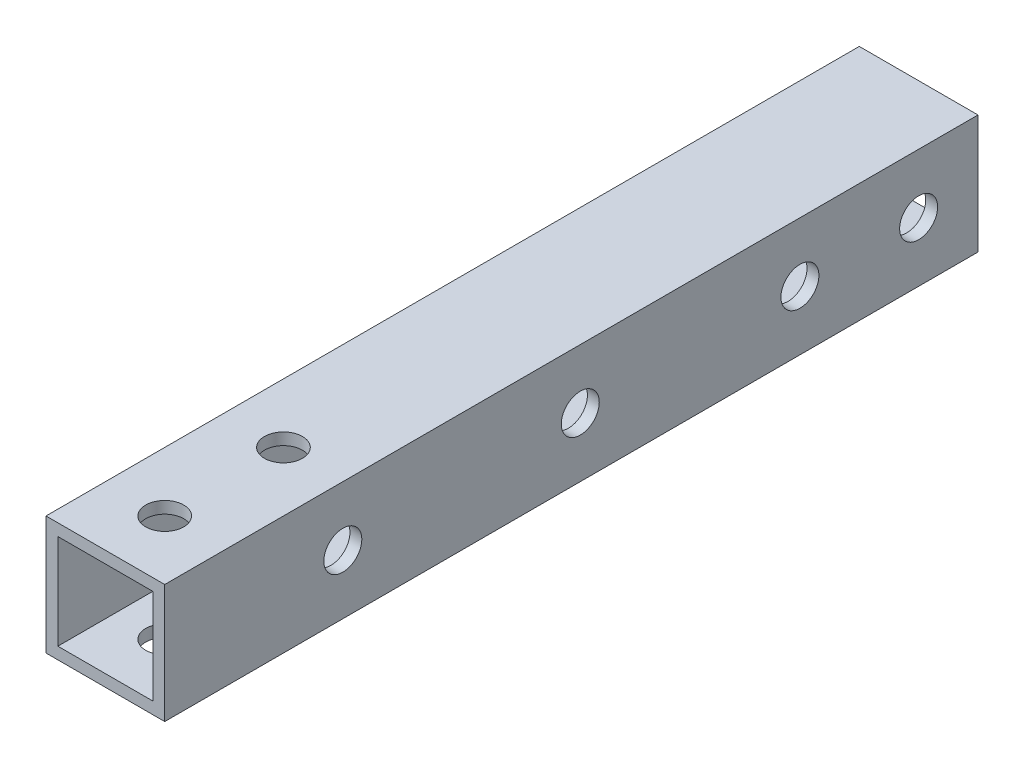
ISO-10303-21;
HEADER;
FILE_DESCRIPTION(('STEP AP214'),'2;1');
FILE_NAME('part.step','',(''),(''),'','','');
FILE_SCHEMA(('AUTOMOTIVE_DESIGN { 1 0 10303 214 1 1 1 1 }'));
ENDSEC;
DATA;
#1=APPLICATION_CONTEXT('core data for automotive mechanical design processes');
#2=APPLICATION_PROTOCOL_DEFINITION('international standard','automotive_design',2000,#1);
#3=PRODUCT_CONTEXT('',#1,'mechanical');
#4=PRODUCT('Part','Part','',(#3));
#5=PRODUCT_RELATED_PRODUCT_CATEGORY('part','',(#4));
#6=PRODUCT_DEFINITION_FORMATION('','',#4);
#7=PRODUCT_DEFINITION_CONTEXT('part definition',#1,'design');
#8=PRODUCT_DEFINITION('design','',#6,#7);
#9=PRODUCT_DEFINITION_SHAPE('','',#8);
#10=(LENGTH_UNIT() NAMED_UNIT(*) SI_UNIT(.MILLI.,.METRE.));
#11=(NAMED_UNIT(*) PLANE_ANGLE_UNIT() SI_UNIT($,.RADIAN.));
#12=(NAMED_UNIT(*) SI_UNIT($,.STERADIAN.) SOLID_ANGLE_UNIT());
#13=UNCERTAINTY_MEASURE_WITH_UNIT(LENGTH_MEASURE(1.E-05),#10,'distance_accuracy_value','');
#14=(GEOMETRIC_REPRESENTATION_CONTEXT(3) GLOBAL_UNCERTAINTY_ASSIGNED_CONTEXT((#13)) GLOBAL_UNIT_ASSIGNED_CONTEXT((#10,
#11,#12)) REPRESENTATION_CONTEXT('',''));
#15=CARTESIAN_POINT('',(0.,0.,0.));
#16=DIRECTION('',(0.,0.,1.));
#17=DIRECTION('',(1.,0.,0.));
#18=AXIS2_PLACEMENT_3D('',#15,#16,#17);
#19=CARTESIAN_POINT('',(0.,0.,68.5));
#20=DIRECTION('',(0.,0.,1.));
#21=DIRECTION('',(1.,0.,0.));
#22=AXIS2_PLACEMENT_3D('',#19,#20,#21);
#23=PLANE('',#22);
#24=DIRECTION('',(0.,-1.,0.));
#25=VECTOR('',#24,1.);
#26=CARTESIAN_POINT('',(-5.,5.,68.5));
#27=LINE('',#26,#25);
#28=CARTESIAN_POINT('',(-5.,5.,68.5));
#29=VERTEX_POINT('',#28);
#30=CARTESIAN_POINT('',(-5.,-5.,68.5));
#31=VERTEX_POINT('',#30);
#32=EDGE_CURVE('E164',#29,#31,#27,.T.);
#33=ORIENTED_EDGE('',*,*,#32,.T.);
#34=DIRECTION('',(1.,0.,0.));
#35=VECTOR('',#34,1.);
#36=CARTESIAN_POINT('',(5.,-5.,68.5));
#37=LINE('',#36,#35);
#38=CARTESIAN_POINT('',(5.,-5.,68.5));
#39=VERTEX_POINT('',#38);
#40=EDGE_CURVE('E167',#31,#39,#37,.T.);
#41=ORIENTED_EDGE('',*,*,#40,.T.);
#42=DIRECTION('',(0.,1.,0.));
#43=VECTOR('',#42,1.);
#44=CARTESIAN_POINT('',(5.,5.,68.5));
#45=LINE('',#44,#43);
#46=CARTESIAN_POINT('',(5.,5.,68.5));
#47=VERTEX_POINT('',#46);
#48=EDGE_CURVE('E170',#39,#47,#45,.T.);
#49=ORIENTED_EDGE('',*,*,#48,.T.);
#50=DIRECTION('',(-1.,0.,0.));
#51=VECTOR('',#50,1.);
#52=CARTESIAN_POINT('',(5.,5.,68.5));
#53=LINE('',#52,#51);
#54=EDGE_CURVE('E172',#47,#29,#53,.T.);
#55=ORIENTED_EDGE('',*,*,#54,.T.);
#56=EDGE_LOOP('',(#33,#41,#49,#55));
#57=FACE_BOUND('',#56,.T.);
#58=DIRECTION('',(1.,0.,0.));
#59=VECTOR('',#58,1.);
#60=CARTESIAN_POINT('',(0.,-4.,68.5));
#61=LINE('',#60,#59);
#62=CARTESIAN_POINT('',(-4.,-4.,68.5));
#63=VERTEX_POINT('',#62);
#64=CARTESIAN_POINT('',(4.,-4.,68.5));
#65=VERTEX_POINT('',#64);
#66=EDGE_CURVE('E134',#63,#65,#61,.T.);
#67=ORIENTED_EDGE('',*,*,#66,.F.);
#68=DIRECTION('',(0.,-1.,0.));
#69=VECTOR('',#68,1.);
#70=CARTESIAN_POINT('',(-4.,0.,68.5));
#71=LINE('',#70,#69);
#72=CARTESIAN_POINT('',(-4.,4.,68.5));
#73=VERTEX_POINT('',#72);
#74=EDGE_CURVE('E126',#73,#63,#71,.T.);
#75=ORIENTED_EDGE('',*,*,#74,.F.);
#76=DIRECTION('',(-1.,0.,0.));
#77=VECTOR('',#76,1.);
#78=CARTESIAN_POINT('',(0.,4.,68.5));
#79=LINE('',#78,#77);
#80=CARTESIAN_POINT('',(4.,4.,68.5));
#81=VERTEX_POINT('',#80);
#82=EDGE_CURVE('E148',#81,#73,#79,.T.);
#83=ORIENTED_EDGE('',*,*,#82,.F.);
#84=DIRECTION('',(0.,1.,0.));
#85=VECTOR('',#84,1.);
#86=CARTESIAN_POINT('',(4.,0.,68.5));
#87=LINE('',#86,#85);
#88=EDGE_CURVE('E146',#65,#81,#87,.T.);
#89=ORIENTED_EDGE('',*,*,#88,.F.);
#90=EDGE_LOOP('',(#67,#75,#83,#89));
#91=FACE_BOUND('',#90,.T.);
#92=ADVANCED_FACE('F59',(#57,#91),#23,.T.);
#93=CARTESIAN_POINT('',(0.,0.,0.));
#94=DIRECTION('',(0.,0.,1.));
#95=DIRECTION('',(1.,0.,0.));
#96=AXIS2_PLACEMENT_3D('',#93,#94,#95);
#97=PLANE('',#96);
#98=DIRECTION('',(0.,-1.,0.));
#99=VECTOR('',#98,1.);
#100=CARTESIAN_POINT('',(-5.,5.,0.));
#101=LINE('',#100,#99);
#102=CARTESIAN_POINT('',(-5.,5.,0.));
#103=VERTEX_POINT('',#102);
#104=CARTESIAN_POINT('',(-5.,-5.,0.));
#105=VERTEX_POINT('',#104);
#106=EDGE_CURVE('E142',#103,#105,#101,.T.);
#107=ORIENTED_EDGE('',*,*,#106,.F.);
#108=DIRECTION('',(-1.,0.,0.));
#109=VECTOR('',#108,1.);
#110=CARTESIAN_POINT('',(5.,5.,0.));
#111=LINE('',#110,#109);
#112=CARTESIAN_POINT('',(5.,5.,0.));
#113=VERTEX_POINT('',#112);
#114=EDGE_CURVE('E168',#113,#103,#111,.T.);
#115=ORIENTED_EDGE('',*,*,#114,.F.);
#116=DIRECTION('',(0.,1.,0.));
#117=VECTOR('',#116,1.);
#118=CARTESIAN_POINT('',(5.,5.,0.));
#119=LINE('',#118,#117);
#120=CARTESIAN_POINT('',(5.,-5.,0.));
#121=VERTEX_POINT('',#120);
#122=EDGE_CURVE('E179',#121,#113,#119,.T.);
#123=ORIENTED_EDGE('',*,*,#122,.F.);
#124=DIRECTION('',(1.,0.,0.));
#125=VECTOR('',#124,1.);
#126=CARTESIAN_POINT('',(5.,-5.,0.));
#127=LINE('',#126,#125);
#128=EDGE_CURVE('E177',#105,#121,#127,.T.);
#129=ORIENTED_EDGE('',*,*,#128,.F.);
#130=EDGE_LOOP('',(#107,#115,#123,#129));
#131=FACE_BOUND('',#130,.T.);
#132=DIRECTION('',(0.,-1.,0.));
#133=VECTOR('',#132,1.);
#134=CARTESIAN_POINT('',(-4.,0.,0.));
#135=LINE('',#134,#133);
#136=CARTESIAN_POINT('',(-4.,4.,0.));
#137=VERTEX_POINT('',#136);
#138=CARTESIAN_POINT('',(-4.,-4.,0.));
#139=VERTEX_POINT('',#138);
#140=EDGE_CURVE('E84',#137,#139,#135,.T.);
#141=ORIENTED_EDGE('',*,*,#140,.T.);
#142=DIRECTION('',(1.,0.,0.));
#143=VECTOR('',#142,1.);
#144=CARTESIAN_POINT('',(0.,-4.,0.));
#145=LINE('',#144,#143);
#146=CARTESIAN_POINT('',(4.,-4.,0.));
#147=VERTEX_POINT('',#146);
#148=EDGE_CURVE('E141',#139,#147,#145,.T.);
#149=ORIENTED_EDGE('',*,*,#148,.T.);
#150=DIRECTION('',(0.,1.,0.));
#151=VECTOR('',#150,1.);
#152=CARTESIAN_POINT('',(4.,0.,0.));
#153=LINE('',#152,#151);
#154=CARTESIAN_POINT('',(4.,4.,0.));
#155=VERTEX_POINT('',#154);
#156=EDGE_CURVE('E156',#147,#155,#153,.T.);
#157=ORIENTED_EDGE('',*,*,#156,.T.);
#158=DIRECTION('',(-1.,0.,0.));
#159=VECTOR('',#158,1.);
#160=CARTESIAN_POINT('',(0.,4.,0.));
#161=LINE('',#160,#159);
#162=EDGE_CURVE('E135',#155,#137,#161,.T.);
#163=ORIENTED_EDGE('',*,*,#162,.T.);
#164=EDGE_LOOP('',(#141,#149,#157,#163));
#165=FACE_BOUND('',#164,.T.);
#166=ADVANCED_FACE('F291',(#131,#165),#97,.F.);
#167=CARTESIAN_POINT('',(-5.,5.,68.5));
#168=DIRECTION('',(1.,0.,0.));
#169=DIRECTION('',(0.,1.,0.));
#170=AXIS2_PLACEMENT_3D('',#167,#168,#169);
#171=PLANE('',#170);
#172=CARTESIAN_POINT('',(-5.,0.,53.5));
#173=DIRECTION('',(1.,0.,0.));
#174=DIRECTION('',(0.,1.,0.));
#175=AXIS2_PLACEMENT_3D('',#172,#173,#174);
#176=CIRCLE('',#175,1.6);
#177=CARTESIAN_POINT('',(-5.,1.6,53.5));
#178=VERTEX_POINT('',#177);
#179=EDGE_CURVE('E208',#178,#178,#176,.T.);
#180=ORIENTED_EDGE('',*,*,#179,.T.);
#181=EDGE_LOOP('',(#180));
#182=FACE_BOUND('',#181,.T.);
#183=CARTESIAN_POINT('',(-5.,0.,33.5));
#184=DIRECTION('',(1.,0.,0.));
#185=DIRECTION('',(0.,1.,0.));
#186=AXIS2_PLACEMENT_3D('',#183,#184,#185);
#187=CIRCLE('',#186,1.6);
#188=CARTESIAN_POINT('',(-5.,1.6,33.5));
#189=VERTEX_POINT('',#188);
#190=EDGE_CURVE('E219',#189,#189,#187,.T.);
#191=ORIENTED_EDGE('',*,*,#190,.T.);
#192=EDGE_LOOP('',(#191));
#193=FACE_BOUND('',#192,.T.);
#194=CARTESIAN_POINT('',(-5.,0.,5.));
#195=DIRECTION('',(1.,0.,0.));
#196=DIRECTION('',(0.,1.,0.));
#197=AXIS2_PLACEMENT_3D('',#194,#195,#196);
#198=CIRCLE('',#197,1.6);
#199=CARTESIAN_POINT('',(-5.,1.6,5.));
#200=VERTEX_POINT('',#199);
#201=EDGE_CURVE('E201',#200,#200,#198,.T.);
#202=ORIENTED_EDGE('',*,*,#201,.T.);
#203=EDGE_LOOP('',(#202));
#204=FACE_BOUND('',#203,.T.);
#205=CARTESIAN_POINT('',(-5.,0.,15.));
#206=DIRECTION('',(1.,0.,0.));
#207=DIRECTION('',(0.,1.,0.));
#208=AXIS2_PLACEMENT_3D('',#205,#206,#207);
#209=CIRCLE('',#208,1.6);
#210=CARTESIAN_POINT('',(-5.,1.6,15.));
#211=VERTEX_POINT('',#210);
#212=EDGE_CURVE('E236',#211,#211,#209,.T.);
#213=ORIENTED_EDGE('',*,*,#212,.T.);
#214=EDGE_LOOP('',(#213));
#215=FACE_BOUND('',#214,.T.);
#216=ORIENTED_EDGE('',*,*,#106,.T.);
#217=DIRECTION('',(0.,0.,-1.));
#218=VECTOR('',#217,1.);
#219=CARTESIAN_POINT('',(-5.,-5.,68.5));
#220=LINE('',#219,#218);
#221=EDGE_CURVE('E12',#31,#105,#220,.T.);
#222=ORIENTED_EDGE('',*,*,#221,.F.);
#223=ORIENTED_EDGE('',*,*,#32,.F.);
#224=DIRECTION('',(0.,0.,-1.));
#225=VECTOR('',#224,1.);
#226=CARTESIAN_POINT('',(-5.,5.,68.5));
#227=LINE('',#226,#225);
#228=EDGE_CURVE('E174',#29,#103,#227,.T.);
#229=ORIENTED_EDGE('',*,*,#228,.T.);
#230=EDGE_LOOP('',(#216,#222,#223,#229));
#231=FACE_BOUND('',#230,.T.);
#232=ADVANCED_FACE('F61',(#182,#193,#204,#215,#231),#171,.F.);
#233=CARTESIAN_POINT('',(5.,-5.,68.5));
#234=DIRECTION('',(0.,1.,0.));
#235=DIRECTION('',(0.,0.,1.));
#236=AXIS2_PLACEMENT_3D('',#233,#234,#235);
#237=PLANE('',#236);
#238=CARTESIAN_POINT('',(0.,-5.,63.5));
#239=DIRECTION('',(0.,1.,0.));
#240=DIRECTION('',(-1.,0.,0.));
#241=AXIS2_PLACEMENT_3D('',#238,#239,#240);
#242=CIRCLE('',#241,1.6);
#243=CARTESIAN_POINT('',(-1.6,-5.,63.5));
#244=VERTEX_POINT('',#243);
#245=EDGE_CURVE('E193',#244,#244,#242,.T.);
#246=ORIENTED_EDGE('',*,*,#245,.T.);
#247=EDGE_LOOP('',(#246));
#248=FACE_BOUND('',#247,.T.);
#249=CARTESIAN_POINT('',(0.,-5.,53.5));
#250=DIRECTION('',(0.,1.,0.));
#251=DIRECTION('',(-1.,0.,0.));
#252=AXIS2_PLACEMENT_3D('',#249,#250,#251);
#253=CIRCLE('',#252,1.6);
#254=CARTESIAN_POINT('',(-1.6,-5.,53.5));
#255=VERTEX_POINT('',#254);
#256=EDGE_CURVE('E251',#255,#255,#253,.T.);
#257=ORIENTED_EDGE('',*,*,#256,.T.);
#258=EDGE_LOOP('',(#257));
#259=FACE_BOUND('',#258,.T.);
#260=ORIENTED_EDGE('',*,*,#128,.T.);
#261=DIRECTION('',(0.,0.,-1.));
#262=VECTOR('',#261,1.);
#263=CARTESIAN_POINT('',(5.,-5.,68.5));
#264=LINE('',#263,#262);
#265=EDGE_CURVE('E68',#39,#121,#264,.T.);
#266=ORIENTED_EDGE('',*,*,#265,.F.);
#267=ORIENTED_EDGE('',*,*,#40,.F.);
#268=ORIENTED_EDGE('',*,*,#221,.T.);
#269=EDGE_LOOP('',(#260,#266,#267,#268));
#270=FACE_BOUND('',#269,.T.);
#271=ADVANCED_FACE('F277',(#248,#259,#270),#237,.F.);
#272=CARTESIAN_POINT('',(5.,5.,68.5));
#273=DIRECTION('',(-1.,0.,0.));
#274=DIRECTION('',(0.,-1.,0.));
#275=AXIS2_PLACEMENT_3D('',#272,#273,#274);
#276=PLANE('',#275);
#277=CARTESIAN_POINT('',(5.,0.,53.5));
#278=DIRECTION('',(1.,0.,0.));
#279=DIRECTION('',(0.,1.,0.));
#280=AXIS2_PLACEMENT_3D('',#277,#278,#279);
#281=CIRCLE('',#280,1.6);
#282=CARTESIAN_POINT('',(5.,1.6,53.5));
#283=VERTEX_POINT('',#282);
#284=EDGE_CURVE('E214',#283,#283,#281,.T.);
#285=ORIENTED_EDGE('',*,*,#284,.F.);
#286=EDGE_LOOP('',(#285));
#287=FACE_BOUND('',#286,.T.);
#288=CARTESIAN_POINT('',(5.,0.,33.5));
#289=DIRECTION('',(1.,0.,0.));
#290=DIRECTION('',(0.,1.,0.));
#291=AXIS2_PLACEMENT_3D('',#288,#289,#290);
#292=CIRCLE('',#291,1.6);
#293=CARTESIAN_POINT('',(5.,1.6,33.5));
#294=VERTEX_POINT('',#293);
#295=EDGE_CURVE('E224',#294,#294,#292,.T.);
#296=ORIENTED_EDGE('',*,*,#295,.F.);
#297=EDGE_LOOP('',(#296));
#298=FACE_BOUND('',#297,.T.);
#299=CARTESIAN_POINT('',(5.,0.,5.));
#300=DIRECTION('',(1.,0.,0.));
#301=DIRECTION('',(0.,1.,0.));
#302=AXIS2_PLACEMENT_3D('',#299,#300,#301);
#303=CIRCLE('',#302,1.6);
#304=CARTESIAN_POINT('',(5.,1.6,5.));
#305=VERTEX_POINT('',#304);
#306=EDGE_CURVE('E233',#305,#305,#303,.T.);
#307=ORIENTED_EDGE('',*,*,#306,.F.);
#308=EDGE_LOOP('',(#307));
#309=FACE_BOUND('',#308,.T.);
#310=CARTESIAN_POINT('',(5.,0.,15.));
#311=DIRECTION('',(1.,0.,0.));
#312=DIRECTION('',(0.,1.,0.));
#313=AXIS2_PLACEMENT_3D('',#310,#311,#312);
#314=CIRCLE('',#313,1.6);
#315=CARTESIAN_POINT('',(5.,1.6,15.));
#316=VERTEX_POINT('',#315);
#317=EDGE_CURVE('E230',#316,#316,#314,.T.);
#318=ORIENTED_EDGE('',*,*,#317,.F.);
#319=EDGE_LOOP('',(#318));
#320=FACE_BOUND('',#319,.T.);
#321=ORIENTED_EDGE('',*,*,#122,.T.);
#322=DIRECTION('',(0.,0.,-1.));
#323=VECTOR('',#322,1.);
#324=CARTESIAN_POINT('',(5.,5.,68.5));
#325=LINE('',#324,#323);
#326=EDGE_CURVE('E184',#47,#113,#325,.T.);
#327=ORIENTED_EDGE('',*,*,#326,.F.);
#328=ORIENTED_EDGE('',*,*,#48,.F.);
#329=ORIENTED_EDGE('',*,*,#265,.T.);
#330=EDGE_LOOP('',(#321,#327,#328,#329));
#331=FACE_BOUND('',#330,.T.);
#332=ADVANCED_FACE('F280',(#287,#298,#309,#320,#331),#276,.F.);
#333=CARTESIAN_POINT('',(5.,5.,68.5));
#334=DIRECTION('',(0.,-1.,0.));
#335=DIRECTION('',(1.,0.,0.));
#336=AXIS2_PLACEMENT_3D('',#333,#334,#335);
#337=PLANE('',#336);
#338=CARTESIAN_POINT('',(0.,5.,63.5));
#339=DIRECTION('',(0.,1.,0.));
#340=DIRECTION('',(-1.,0.,0.));
#341=AXIS2_PLACEMENT_3D('',#338,#339,#340);
#342=CIRCLE('',#341,1.6);
#343=CARTESIAN_POINT('',(-1.6,5.,63.5));
#344=VERTEX_POINT('',#343);
#345=EDGE_CURVE('E248',#344,#344,#342,.T.);
#346=ORIENTED_EDGE('',*,*,#345,.F.);
#347=EDGE_LOOP('',(#346));
#348=FACE_BOUND('',#347,.T.);
#349=CARTESIAN_POINT('',(0.,5.,53.5));
#350=DIRECTION('',(0.,1.,0.));
#351=DIRECTION('',(-1.,0.,0.));
#352=AXIS2_PLACEMENT_3D('',#349,#350,#351);
#353=CIRCLE('',#352,1.6);
#354=CARTESIAN_POINT('',(-1.6,5.,53.5));
#355=VERTEX_POINT('',#354);
#356=EDGE_CURVE('E245',#355,#355,#353,.T.);
#357=ORIENTED_EDGE('',*,*,#356,.F.);
#358=EDGE_LOOP('',(#357));
#359=FACE_BOUND('',#358,.T.);
#360=ORIENTED_EDGE('',*,*,#114,.T.);
#361=ORIENTED_EDGE('',*,*,#228,.F.);
#362=ORIENTED_EDGE('',*,*,#54,.F.);
#363=ORIENTED_EDGE('',*,*,#326,.T.);
#364=EDGE_LOOP('',(#360,#361,#362,#363));
#365=FACE_BOUND('',#364,.T.);
#366=ADVANCED_FACE('F295',(#348,#359,#365),#337,.F.);
#367=CARTESIAN_POINT('',(-4.,0.,68.5));
#368=DIRECTION('',(1.,0.,0.));
#369=DIRECTION('',(0.,1.,0.));
#370=AXIS2_PLACEMENT_3D('',#367,#368,#369);
#371=PLANE('',#370);
#372=CARTESIAN_POINT('',(-4.,0.,53.5));
#373=DIRECTION('',(1.,0.,0.));
#374=DIRECTION('',(0.,1.,0.));
#375=AXIS2_PLACEMENT_3D('',#372,#373,#374);
#376=CIRCLE('',#375,1.6);
#377=CARTESIAN_POINT('',(-4.,1.6,53.5));
#378=VERTEX_POINT('',#377);
#379=EDGE_CURVE('E227',#378,#378,#376,.T.);
#380=ORIENTED_EDGE('',*,*,#379,.F.);
#381=EDGE_LOOP('',(#380));
#382=FACE_BOUND('',#381,.T.);
#383=CARTESIAN_POINT('',(-4.,0.,33.5));
#384=DIRECTION('',(1.,0.,0.));
#385=DIRECTION('',(0.,1.,0.));
#386=AXIS2_PLACEMENT_3D('',#383,#384,#385);
#387=CIRCLE('',#386,1.6);
#388=CARTESIAN_POINT('',(-4.,1.6,33.5));
#389=VERTEX_POINT('',#388);
#390=EDGE_CURVE('E207',#389,#389,#387,.T.);
#391=ORIENTED_EDGE('',*,*,#390,.F.);
#392=EDGE_LOOP('',(#391));
#393=FACE_BOUND('',#392,.T.);
#394=CARTESIAN_POINT('',(-4.,0.,5.));
#395=DIRECTION('',(1.,0.,0.));
#396=DIRECTION('',(0.,1.,0.));
#397=AXIS2_PLACEMENT_3D('',#394,#395,#396);
#398=CIRCLE('',#397,1.6);
#399=CARTESIAN_POINT('',(-4.,1.6,5.));
#400=VERTEX_POINT('',#399);
#401=EDGE_CURVE('E204',#400,#400,#398,.T.);
#402=ORIENTED_EDGE('',*,*,#401,.F.);
#403=EDGE_LOOP('',(#402));
#404=FACE_BOUND('',#403,.T.);
#405=CARTESIAN_POINT('',(-4.,0.,15.));
#406=DIRECTION('',(1.,0.,0.));
#407=DIRECTION('',(0.,1.,0.));
#408=AXIS2_PLACEMENT_3D('',#405,#406,#407);
#409=CIRCLE('',#408,1.6);
#410=CARTESIAN_POINT('',(-4.,1.6,15.));
#411=VERTEX_POINT('',#410);
#412=EDGE_CURVE('E200',#411,#411,#409,.T.);
#413=ORIENTED_EDGE('',*,*,#412,.F.);
#414=EDGE_LOOP('',(#413));
#415=FACE_BOUND('',#414,.T.);
#416=ORIENTED_EDGE('',*,*,#140,.F.);
#417=DIRECTION('',(0.,0.,-1.));
#418=VECTOR('',#417,1.);
#419=CARTESIAN_POINT('',(-4.,4.,68.5));
#420=LINE('',#419,#418);
#421=EDGE_CURVE('E130',#73,#137,#420,.T.);
#422=ORIENTED_EDGE('',*,*,#421,.F.);
#423=ORIENTED_EDGE('',*,*,#74,.T.);
#424=DIRECTION('',(0.,0.,-1.));
#425=VECTOR('',#424,1.);
#426=CARTESIAN_POINT('',(-4.,-4.,68.5));
#427=LINE('',#426,#425);
#428=EDGE_CURVE('E129',#63,#139,#427,.T.);
#429=ORIENTED_EDGE('',*,*,#428,.T.);
#430=EDGE_LOOP('',(#416,#422,#423,#429));
#431=FACE_BOUND('',#430,.T.);
#432=ADVANCED_FACE('F128',(#382,#393,#404,#415,#431),#371,.T.);
#433=CARTESIAN_POINT('',(0.,-4.,68.5));
#434=DIRECTION('',(0.,1.,0.));
#435=DIRECTION('',(0.,0.,1.));
#436=AXIS2_PLACEMENT_3D('',#433,#434,#435);
#437=PLANE('',#436);
#438=CARTESIAN_POINT('',(0.,-4.,63.5));
#439=DIRECTION('',(0.,1.,0.));
#440=DIRECTION('',(0.,0.,1.));
#441=AXIS2_PLACEMENT_3D('',#438,#439,#440);
#442=CIRCLE('',#441,1.6);
#443=CARTESIAN_POINT('',(0.,-4.,65.1));
#444=VERTEX_POINT('',#443);
#445=EDGE_CURVE('E154',#444,#444,#442,.T.);
#446=ORIENTED_EDGE('',*,*,#445,.F.);
#447=EDGE_LOOP('',(#446));
#448=FACE_BOUND('',#447,.T.);
#449=CARTESIAN_POINT('',(0.,-4.,53.5));
#450=DIRECTION('',(0.,1.,0.));
#451=DIRECTION('',(0.,0.,1.));
#452=AXIS2_PLACEMENT_3D('',#449,#450,#451);
#453=CIRCLE('',#452,1.6);
#454=CARTESIAN_POINT('',(0.,-4.,55.1));
#455=VERTEX_POINT('',#454);
#456=EDGE_CURVE('E192',#455,#455,#453,.T.);
#457=ORIENTED_EDGE('',*,*,#456,.F.);
#458=EDGE_LOOP('',(#457));
#459=FACE_BOUND('',#458,.T.);
#460=ORIENTED_EDGE('',*,*,#148,.F.);
#461=ORIENTED_EDGE('',*,*,#428,.F.);
#462=ORIENTED_EDGE('',*,*,#66,.T.);
#463=DIRECTION('',(0.,0.,-1.));
#464=VECTOR('',#463,1.);
#465=CARTESIAN_POINT('',(4.,-4.,68.5));
#466=LINE('',#465,#464);
#467=EDGE_CURVE('E143',#65,#147,#466,.T.);
#468=ORIENTED_EDGE('',*,*,#467,.T.);
#469=EDGE_LOOP('',(#460,#461,#462,#468));
#470=FACE_BOUND('',#469,.T.);
#471=ADVANCED_FACE('F138',(#448,#459,#470),#437,.T.);
#472=CARTESIAN_POINT('',(4.,0.,68.5));
#473=DIRECTION('',(-1.,0.,0.));
#474=DIRECTION('',(0.,-1.,0.));
#475=AXIS2_PLACEMENT_3D('',#472,#473,#474);
#476=PLANE('',#475);
#477=CARTESIAN_POINT('',(4.,0.,53.5));
#478=DIRECTION('',(-1.,0.,0.));
#479=DIRECTION('',(0.,-1.,0.));
#480=AXIS2_PLACEMENT_3D('',#477,#478,#479);
#481=CIRCLE('',#480,1.6);
#482=CARTESIAN_POINT('',(4.,-1.6,53.5));
#483=VERTEX_POINT('',#482);
#484=EDGE_CURVE('E63',#483,#483,#481,.T.);
#485=ORIENTED_EDGE('',*,*,#484,.F.);
#486=EDGE_LOOP('',(#485));
#487=FACE_BOUND('',#486,.T.);
#488=CARTESIAN_POINT('',(4.,0.,33.5));
#489=DIRECTION('',(-1.,0.,0.));
#490=DIRECTION('',(0.,-1.,0.));
#491=AXIS2_PLACEMENT_3D('',#488,#489,#490);
#492=CIRCLE('',#491,1.6);
#493=CARTESIAN_POINT('',(4.,-1.6,33.5));
#494=VERTEX_POINT('',#493);
#495=EDGE_CURVE('E205',#494,#494,#492,.T.);
#496=ORIENTED_EDGE('',*,*,#495,.F.);
#497=EDGE_LOOP('',(#496));
#498=FACE_BOUND('',#497,.T.);
#499=CARTESIAN_POINT('',(4.,0.,5.));
#500=DIRECTION('',(-1.,0.,0.));
#501=DIRECTION('',(0.,-1.,0.));
#502=AXIS2_PLACEMENT_3D('',#499,#500,#501);
#503=CIRCLE('',#502,1.6);
#504=CARTESIAN_POINT('',(4.,-1.6,5.));
#505=VERTEX_POINT('',#504);
#506=EDGE_CURVE('E202',#505,#505,#503,.T.);
#507=ORIENTED_EDGE('',*,*,#506,.F.);
#508=EDGE_LOOP('',(#507));
#509=FACE_BOUND('',#508,.T.);
#510=CARTESIAN_POINT('',(4.,0.,15.));
#511=DIRECTION('',(-1.,0.,0.));
#512=DIRECTION('',(0.,-1.,0.));
#513=AXIS2_PLACEMENT_3D('',#510,#511,#512);
#514=CIRCLE('',#513,1.6);
#515=CARTESIAN_POINT('',(4.,-1.6,15.));
#516=VERTEX_POINT('',#515);
#517=EDGE_CURVE('E197',#516,#516,#514,.T.);
#518=ORIENTED_EDGE('',*,*,#517,.F.);
#519=EDGE_LOOP('',(#518));
#520=FACE_BOUND('',#519,.T.);
#521=ORIENTED_EDGE('',*,*,#156,.F.);
#522=ORIENTED_EDGE('',*,*,#467,.F.);
#523=ORIENTED_EDGE('',*,*,#88,.T.);
#524=DIRECTION('',(0.,0.,-1.));
#525=VECTOR('',#524,1.);
#526=CARTESIAN_POINT('',(4.,4.,68.5));
#527=LINE('',#526,#525);
#528=EDGE_CURVE('E76',#81,#155,#527,.T.);
#529=ORIENTED_EDGE('',*,*,#528,.T.);
#530=EDGE_LOOP('',(#521,#522,#523,#529));
#531=FACE_BOUND('',#530,.T.);
#532=ADVANCED_FACE('F265',(#487,#498,#509,#520,#531),#476,.T.);
#533=CARTESIAN_POINT('',(0.,4.,68.5));
#534=DIRECTION('',(0.,-1.,0.));
#535=DIRECTION('',(1.,0.,0.));
#536=AXIS2_PLACEMENT_3D('',#533,#534,#535);
#537=PLANE('',#536);
#538=CARTESIAN_POINT('',(0.,4.,63.5));
#539=DIRECTION('',(0.,-1.,0.));
#540=DIRECTION('',(1.,0.,0.));
#541=AXIS2_PLACEMENT_3D('',#538,#539,#540);
#542=CIRCLE('',#541,1.6);
#543=CARTESIAN_POINT('',(1.60000000000001,4.,63.5));
#544=VERTEX_POINT('',#543);
#545=EDGE_CURVE('E194',#544,#544,#542,.T.);
#546=ORIENTED_EDGE('',*,*,#545,.F.);
#547=EDGE_LOOP('',(#546));
#548=FACE_BOUND('',#547,.T.);
#549=CARTESIAN_POINT('',(0.,4.,53.5));
#550=DIRECTION('',(0.,-1.,0.));
#551=DIRECTION('',(1.,0.,0.));
#552=AXIS2_PLACEMENT_3D('',#549,#550,#551);
#553=CIRCLE('',#552,1.6);
#554=CARTESIAN_POINT('',(1.60000000000001,4.,53.5));
#555=VERTEX_POINT('',#554);
#556=EDGE_CURVE('E189',#555,#555,#553,.T.);
#557=ORIENTED_EDGE('',*,*,#556,.F.);
#558=EDGE_LOOP('',(#557));
#559=FACE_BOUND('',#558,.T.);
#560=ORIENTED_EDGE('',*,*,#162,.F.);
#561=ORIENTED_EDGE('',*,*,#528,.F.);
#562=ORIENTED_EDGE('',*,*,#82,.T.);
#563=ORIENTED_EDGE('',*,*,#421,.T.);
#564=EDGE_LOOP('',(#560,#561,#562,#563));
#565=FACE_BOUND('',#564,.T.);
#566=ADVANCED_FACE('F437',(#548,#559,#565),#537,.T.);
#567=CARTESIAN_POINT('',(0.,-5.,53.5));
#568=DIRECTION('',(0.,1.,0.));
#569=DIRECTION('',(-1.,0.,0.));
#570=AXIS2_PLACEMENT_3D('',#567,#568,#569);
#571=CYLINDRICAL_SURFACE('',#570,1.6);
#572=ORIENTED_EDGE('',*,*,#556,.T.);
#573=EDGE_LOOP('',(#572));
#574=FACE_BOUND('',#573,.T.);
#575=ORIENTED_EDGE('',*,*,#356,.T.);
#576=EDGE_LOOP('',(#575));
#577=FACE_BOUND('',#576,.T.);
#578=ADVANCED_FACE('F274',(#574,#577),#571,.F.);
#579=CARTESIAN_POINT('',(0.,-5.,63.5));
#580=DIRECTION('',(0.,1.,0.));
#581=DIRECTION('',(-1.,0.,0.));
#582=AXIS2_PLACEMENT_3D('',#579,#580,#581);
#583=CYLINDRICAL_SURFACE('',#582,1.6);
#584=ORIENTED_EDGE('',*,*,#545,.T.);
#585=EDGE_LOOP('',(#584));
#586=FACE_BOUND('',#585,.T.);
#587=ORIENTED_EDGE('',*,*,#345,.T.);
#588=EDGE_LOOP('',(#587));
#589=FACE_BOUND('',#588,.T.);
#590=ADVANCED_FACE('F272',(#586,#589),#583,.F.);
#591=ORIENTED_EDGE('',*,*,#456,.T.);
#592=EDGE_LOOP('',(#591));
#593=FACE_BOUND('',#592,.T.);
#594=ORIENTED_EDGE('',*,*,#256,.F.);
#595=EDGE_LOOP('',(#594));
#596=FACE_BOUND('',#595,.T.);
#597=ADVANCED_FACE('F269',(#593,#596),#571,.F.);
#598=ORIENTED_EDGE('',*,*,#445,.T.);
#599=EDGE_LOOP('',(#598));
#600=FACE_BOUND('',#599,.T.);
#601=ORIENTED_EDGE('',*,*,#245,.F.);
#602=EDGE_LOOP('',(#601));
#603=FACE_BOUND('',#602,.T.);
#604=ADVANCED_FACE('F260',(#600,#603),#583,.F.);
#605=CARTESIAN_POINT('',(-5.,0.,15.));
#606=DIRECTION('',(1.,0.,0.));
#607=DIRECTION('',(0.,1.,0.));
#608=AXIS2_PLACEMENT_3D('',#605,#606,#607);
#609=CYLINDRICAL_SURFACE('',#608,1.6);
#610=ORIENTED_EDGE('',*,*,#517,.T.);
#611=EDGE_LOOP('',(#610));
#612=FACE_BOUND('',#611,.T.);
#613=ORIENTED_EDGE('',*,*,#317,.T.);
#614=EDGE_LOOP('',(#613));
#615=FACE_BOUND('',#614,.T.);
#616=ADVANCED_FACE('F323',(#612,#615),#609,.F.);
#617=CARTESIAN_POINT('',(-5.,0.,5.));
#618=DIRECTION('',(1.,0.,0.));
#619=DIRECTION('',(0.,1.,0.));
#620=AXIS2_PLACEMENT_3D('',#617,#618,#619);
#621=CYLINDRICAL_SURFACE('',#620,1.6);
#622=ORIENTED_EDGE('',*,*,#506,.T.);
#623=EDGE_LOOP('',(#622));
#624=FACE_BOUND('',#623,.T.);
#625=ORIENTED_EDGE('',*,*,#306,.T.);
#626=EDGE_LOOP('',(#625));
#627=FACE_BOUND('',#626,.T.);
#628=ADVANCED_FACE('F325',(#624,#627),#621,.F.);
#629=ORIENTED_EDGE('',*,*,#412,.T.);
#630=EDGE_LOOP('',(#629));
#631=FACE_BOUND('',#630,.T.);
#632=ORIENTED_EDGE('',*,*,#212,.F.);
#633=EDGE_LOOP('',(#632));
#634=FACE_BOUND('',#633,.T.);
#635=ADVANCED_FACE('F328',(#631,#634),#609,.F.);
#636=ORIENTED_EDGE('',*,*,#401,.T.);
#637=EDGE_LOOP('',(#636));
#638=FACE_BOUND('',#637,.T.);
#639=ORIENTED_EDGE('',*,*,#201,.F.);
#640=EDGE_LOOP('',(#639));
#641=FACE_BOUND('',#640,.T.);
#642=ADVANCED_FACE('F335',(#638,#641),#621,.F.);
#643=CARTESIAN_POINT('',(-5.,0.,33.5));
#644=DIRECTION('',(1.,0.,0.));
#645=DIRECTION('',(0.,1.,0.));
#646=AXIS2_PLACEMENT_3D('',#643,#644,#645);
#647=CYLINDRICAL_SURFACE('',#646,1.6);
#648=ORIENTED_EDGE('',*,*,#495,.T.);
#649=EDGE_LOOP('',(#648));
#650=FACE_BOUND('',#649,.T.);
#651=ORIENTED_EDGE('',*,*,#295,.T.);
#652=EDGE_LOOP('',(#651));
#653=FACE_BOUND('',#652,.T.);
#654=ADVANCED_FACE('F342',(#650,#653),#647,.F.);
#655=CARTESIAN_POINT('',(-5.,0.,53.5));
#656=DIRECTION('',(1.,0.,0.));
#657=DIRECTION('',(0.,1.,0.));
#658=AXIS2_PLACEMENT_3D('',#655,#656,#657);
#659=CYLINDRICAL_SURFACE('',#658,1.6);
#660=ORIENTED_EDGE('',*,*,#484,.T.);
#661=EDGE_LOOP('',(#660));
#662=FACE_BOUND('',#661,.T.);
#663=ORIENTED_EDGE('',*,*,#284,.T.);
#664=EDGE_LOOP('',(#663));
#665=FACE_BOUND('',#664,.T.);
#666=ADVANCED_FACE('F360',(#662,#665),#659,.F.);
#667=ORIENTED_EDGE('',*,*,#390,.T.);
#668=EDGE_LOOP('',(#667));
#669=FACE_BOUND('',#668,.T.);
#670=ORIENTED_EDGE('',*,*,#190,.F.);
#671=EDGE_LOOP('',(#670));
#672=FACE_BOUND('',#671,.T.);
#673=ADVANCED_FACE('F357',(#669,#672),#647,.F.);
#674=ORIENTED_EDGE('',*,*,#379,.T.);
#675=EDGE_LOOP('',(#674));
#676=FACE_BOUND('',#675,.T.);
#677=ORIENTED_EDGE('',*,*,#179,.F.);
#678=EDGE_LOOP('',(#677));
#679=FACE_BOUND('',#678,.T.);
#680=ADVANCED_FACE('F359',(#676,#679),#659,.F.);
#681=CLOSED_SHELL('',(#92,#166,#232,#271,#332,#366,#432,#471,#532,#566,#578,#590,#597,#604,#616,
#628,#635,#642,#654,#666,#673,#680));
#682=MANIFOLD_SOLID_BREP('B2',#681);
#683=ADVANCED_BREP_SHAPE_REPRESENTATION('',(#18,#682),#14);
#684=SHAPE_DEFINITION_REPRESENTATION(#9,#683);
ENDSEC;
END-ISO-10303-21;
